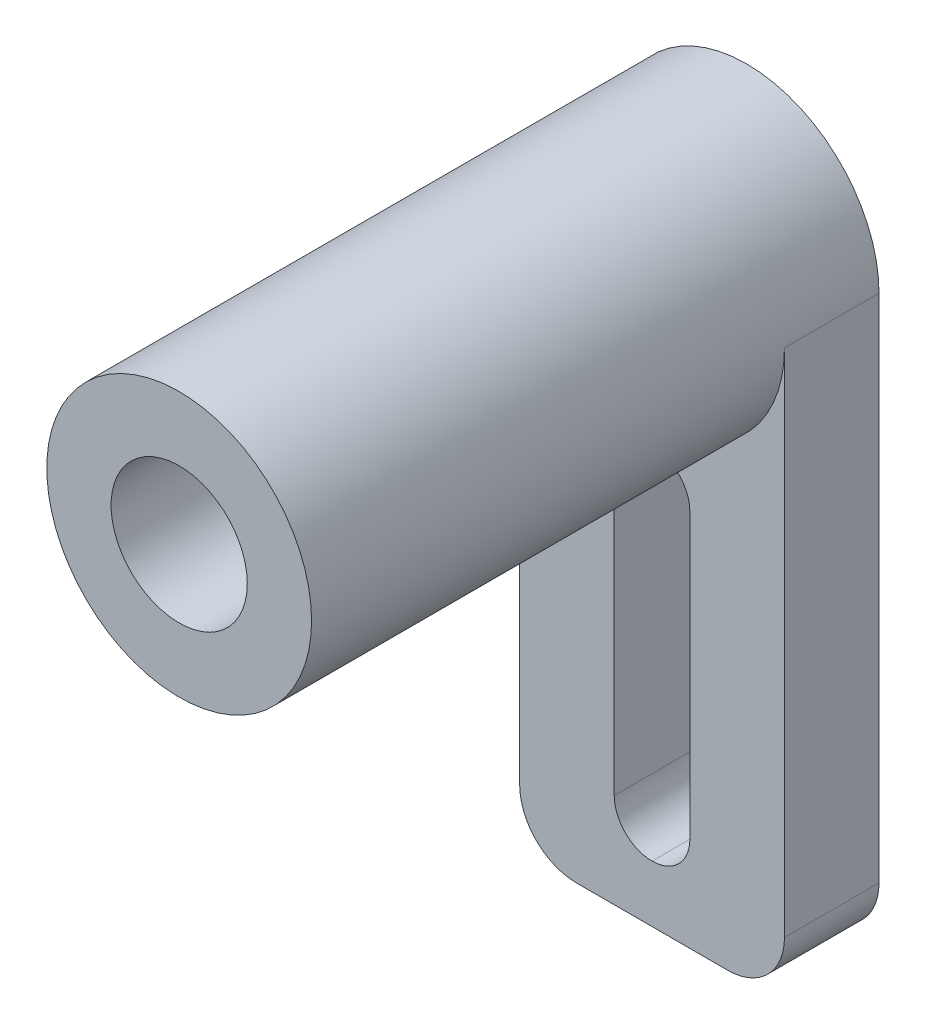
ISO-10303-21;
HEADER;
FILE_DESCRIPTION(('STEP AP214'),'2;1');
FILE_NAME('part.step','',(''),(''),'','','');
FILE_SCHEMA(('AUTOMOTIVE_DESIGN { 1 0 10303 214 1 1 1 1 }'));
ENDSEC;
DATA;
#1=APPLICATION_CONTEXT('core data for automotive mechanical design processes');
#2=APPLICATION_PROTOCOL_DEFINITION('international standard','automotive_design',2000,#1);
#3=PRODUCT_CONTEXT('',#1,'mechanical');
#4=PRODUCT('Part','Part','',(#3));
#5=PRODUCT_RELATED_PRODUCT_CATEGORY('part','',(#4));
#6=PRODUCT_DEFINITION_FORMATION('','',#4);
#7=PRODUCT_DEFINITION_CONTEXT('part definition',#1,'design');
#8=PRODUCT_DEFINITION('design','',#6,#7);
#9=PRODUCT_DEFINITION_SHAPE('','',#8);
#10=(LENGTH_UNIT() NAMED_UNIT(*) SI_UNIT(.MILLI.,.METRE.));
#11=(NAMED_UNIT(*) PLANE_ANGLE_UNIT() SI_UNIT($,.RADIAN.));
#12=(NAMED_UNIT(*) SI_UNIT($,.STERADIAN.) SOLID_ANGLE_UNIT());
#13=UNCERTAINTY_MEASURE_WITH_UNIT(LENGTH_MEASURE(1.E-05),#10,'distance_accuracy_value','');
#14=(GEOMETRIC_REPRESENTATION_CONTEXT(3) GLOBAL_UNCERTAINTY_ASSIGNED_CONTEXT((#13)) GLOBAL_UNIT_ASSIGNED_CONTEXT((#10,
#11,#12)) REPRESENTATION_CONTEXT('',''));
#15=CARTESIAN_POINT('',(0.,0.,0.));
#16=DIRECTION('',(0.,0.,1.));
#17=DIRECTION('',(1.,0.,0.));
#18=AXIS2_PLACEMENT_3D('',#15,#16,#17);
#19=CARTESIAN_POINT('',(7.,30.,30.));
#20=DIRECTION('',(0.,0.,-1.));
#21=DIRECTION('',(-1.,0.,0.));
#22=AXIS2_PLACEMENT_3D('',#19,#20,#21);
#23=CYLINDRICAL_SURFACE('',#22,3.05);
#24=CARTESIAN_POINT('',(7.,30.,1.));
#25=DIRECTION('',(0.,0.,-1.));
#26=DIRECTION('',(-1.,0.,0.));
#27=AXIS2_PLACEMENT_3D('',#24,#25,#26);
#28=CIRCLE('',#27,3.05);
#29=CARTESIAN_POINT('',(3.95,30.,1.));
#30=VERTEX_POINT('',#29);
#31=EDGE_CURVE('E153',#30,#30,#28,.T.);
#32=ORIENTED_EDGE('',*,*,#31,.T.);
#33=EDGE_LOOP('',(#32));
#34=FACE_BOUND('',#33,.T.);
#35=CARTESIAN_POINT('',(7.,30.,8.));
#36=DIRECTION('',(0.,0.,1.));
#37=DIRECTION('',(1.,0.,0.));
#38=AXIS2_PLACEMENT_3D('',#35,#36,#37);
#39=CIRCLE('',#38,3.05);
#40=CARTESIAN_POINT('',(10.05,30.,8.));
#41=VERTEX_POINT('',#40);
#42=EDGE_CURVE('E44',#41,#41,#39,.T.);
#43=ORIENTED_EDGE('',*,*,#42,.T.);
#44=EDGE_LOOP('',(#43));
#45=FACE_BOUND('',#44,.T.);
#46=ADVANCED_FACE('F40',(#34,#45),#23,.F.);
#47=CARTESIAN_POINT('',(7.,30.,30.));
#48=DIRECTION('',(0.,0.,-1.));
#49=DIRECTION('',(-1.,0.,0.));
#50=AXIS2_PLACEMENT_3D('',#47,#48,#49);
#51=CYLINDRICAL_SURFACE('',#50,7.);
#52=CARTESIAN_POINT('',(7.,30.,30.));
#53=DIRECTION('',(0.,0.,1.));
#54=DIRECTION('',(1.,0.,0.));
#55=AXIS2_PLACEMENT_3D('',#52,#53,#54);
#56=CIRCLE('',#55,7.);
#57=CARTESIAN_POINT('',(14.,30.,30.));
#58=VERTEX_POINT('',#57);
#59=EDGE_CURVE('E146',#58,#58,#56,.T.);
#60=ORIENTED_EDGE('',*,*,#59,.F.);
#61=EDGE_LOOP('',(#60));
#62=FACE_BOUND('',#61,.T.);
#63=DIRECTION('',(0.,0.,-1.));
#64=VECTOR('',#63,1.);
#65=CARTESIAN_POINT('',(0.,30.,5.));
#66=LINE('',#65,#64);
#67=CARTESIAN_POINT('',(0.,30.,5.));
#68=VERTEX_POINT('',#67);
#69=CARTESIAN_POINT('',(0.,30.,0.));
#70=VERTEX_POINT('',#69);
#71=EDGE_CURVE('E151',#68,#70,#66,.T.);
#72=ORIENTED_EDGE('',*,*,#71,.F.);
#73=CARTESIAN_POINT('',(7.,30.,5.));
#74=DIRECTION('',(0.,0.,-1.));
#75=DIRECTION('',(-1.,0.,0.));
#76=AXIS2_PLACEMENT_3D('',#73,#74,#75);
#77=CIRCLE('',#76,7.);
#78=CARTESIAN_POINT('',(14.,30.,5.));
#79=VERTEX_POINT('',#78);
#80=EDGE_CURVE('E150',#68,#79,#77,.F.);
#81=ORIENTED_EDGE('',*,*,#80,.T.);
#82=DIRECTION('',(0.,0.,-1.));
#83=VECTOR('',#82,1.);
#84=CARTESIAN_POINT('',(14.,30.,5.));
#85=LINE('',#84,#83);
#86=CARTESIAN_POINT('',(14.,30.,0.));
#87=VERTEX_POINT('',#86);
#88=EDGE_CURVE('E137',#79,#87,#85,.T.);
#89=ORIENTED_EDGE('',*,*,#88,.T.);
#90=CARTESIAN_POINT('',(7.,30.,0.));
#91=DIRECTION('',(0.,0.,1.));
#92=DIRECTION('',(1.,0.,0.));
#93=AXIS2_PLACEMENT_3D('',#90,#91,#92);
#94=CIRCLE('',#93,7.);
#95=EDGE_CURVE('E141',#87,#70,#94,.T.);
#96=ORIENTED_EDGE('',*,*,#95,.T.);
#97=EDGE_LOOP('',(#72,#81,#89,#96));
#98=FACE_BOUND('',#97,.T.);
#99=ADVANCED_FACE('F149',(#62,#98),#51,.T.);
#100=CARTESIAN_POINT('',(0.,0.,5.));
#101=DIRECTION('',(1.,0.,0.));
#102=DIRECTION('',(0.,0.,-1.));
#103=AXIS2_PLACEMENT_3D('',#100,#101,#102);
#104=PLANE('',#103);
#105=DIRECTION('',(0.,-1.,0.));
#106=VECTOR('',#105,1.);
#107=CARTESIAN_POINT('',(0.,0.,0.));
#108=LINE('',#107,#106);
#109=CARTESIAN_POINT('',(0.,3.,0.));
#110=VERTEX_POINT('',#109);
#111=EDGE_CURVE('E65',#70,#110,#108,.T.);
#112=ORIENTED_EDGE('',*,*,#111,.T.);
#113=DIRECTION('',(0.,0.,-1.));
#114=VECTOR('',#113,1.);
#115=CARTESIAN_POINT('',(0.,3.,5.));
#116=LINE('',#115,#114);
#117=CARTESIAN_POINT('',(0.,3.,5.));
#118=VERTEX_POINT('',#117);
#119=EDGE_CURVE('E222',#110,#118,#116,.F.);
#120=ORIENTED_EDGE('',*,*,#119,.T.);
#121=DIRECTION('',(0.,-1.,0.));
#122=VECTOR('',#121,1.);
#123=CARTESIAN_POINT('',(0.,0.,5.));
#124=LINE('',#123,#122);
#125=EDGE_CURVE('E57',#68,#118,#124,.T.);
#126=ORIENTED_EDGE('',*,*,#125,.F.);
#127=ORIENTED_EDGE('',*,*,#71,.T.);
#128=EDGE_LOOP('',(#112,#120,#126,#127));
#129=FACE_BOUND('',#128,.T.);
#130=ADVANCED_FACE('F264',(#129),#104,.F.);
#131=CARTESIAN_POINT('',(0.,0.,5.));
#132=DIRECTION('',(0.,1.,0.));
#133=DIRECTION('',(0.,0.,1.));
#134=AXIS2_PLACEMENT_3D('',#131,#132,#133);
#135=PLANE('',#134);
#136=DIRECTION('',(1.,0.,0.));
#137=VECTOR('',#136,1.);
#138=CARTESIAN_POINT('',(0.,0.,5.));
#139=LINE('',#138,#137);
#140=CARTESIAN_POINT('',(3.,0.,5.));
#141=VERTEX_POINT('',#140);
#142=CARTESIAN_POINT('',(11.,0.,5.));
#143=VERTEX_POINT('',#142);
#144=EDGE_CURVE('E175',#141,#143,#139,.T.);
#145=ORIENTED_EDGE('',*,*,#144,.F.);
#146=DIRECTION('',(0.,0.,-1.));
#147=VECTOR('',#146,1.);
#148=CARTESIAN_POINT('',(3.,0.,5.));
#149=LINE('',#148,#147);
#150=CARTESIAN_POINT('',(3.,0.,0.));
#151=VERTEX_POINT('',#150);
#152=EDGE_CURVE('E215',#141,#151,#149,.T.);
#153=ORIENTED_EDGE('',*,*,#152,.T.);
#154=DIRECTION('',(1.,0.,0.));
#155=VECTOR('',#154,1.);
#156=CARTESIAN_POINT('',(0.,0.,0.));
#157=LINE('',#156,#155);
#158=CARTESIAN_POINT('',(11.,0.,0.));
#159=VERTEX_POINT('',#158);
#160=EDGE_CURVE('E139',#151,#159,#157,.T.);
#161=ORIENTED_EDGE('',*,*,#160,.T.);
#162=DIRECTION('',(0.,0.,-1.));
#163=VECTOR('',#162,1.);
#164=CARTESIAN_POINT('',(11.,0.,5.));
#165=LINE('',#164,#163);
#166=EDGE_CURVE('E209',#159,#143,#165,.F.);
#167=ORIENTED_EDGE('',*,*,#166,.T.);
#168=EDGE_LOOP('',(#145,#153,#161,#167));
#169=FACE_BOUND('',#168,.T.);
#170=ADVANCED_FACE('F292',(#169),#135,.F.);
#171=CARTESIAN_POINT('',(14.,0.,5.));
#172=DIRECTION('',(-1.,0.,0.));
#173=DIRECTION('',(0.,0.,1.));
#174=AXIS2_PLACEMENT_3D('',#171,#172,#173);
#175=PLANE('',#174);
#176=DIRECTION('',(0.,1.,0.));
#177=VECTOR('',#176,1.);
#178=CARTESIAN_POINT('',(14.,0.,5.));
#179=LINE('',#178,#177);
#180=CARTESIAN_POINT('',(14.,3.,5.));
#181=VERTEX_POINT('',#180);
#182=EDGE_CURVE('E178',#181,#79,#179,.T.);
#183=ORIENTED_EDGE('',*,*,#182,.F.);
#184=DIRECTION('',(0.,0.,-1.));
#185=VECTOR('',#184,1.);
#186=CARTESIAN_POINT('',(14.,3.,5.));
#187=LINE('',#186,#185);
#188=CARTESIAN_POINT('',(14.,3.,0.));
#189=VERTEX_POINT('',#188);
#190=EDGE_CURVE('E11',#181,#189,#187,.T.);
#191=ORIENTED_EDGE('',*,*,#190,.T.);
#192=DIRECTION('',(0.,1.,0.));
#193=VECTOR('',#192,1.);
#194=CARTESIAN_POINT('',(14.,0.,0.));
#195=LINE('',#194,#193);
#196=EDGE_CURVE('E133',#189,#87,#195,.T.);
#197=ORIENTED_EDGE('',*,*,#196,.T.);
#198=ORIENTED_EDGE('',*,*,#88,.F.);
#199=EDGE_LOOP('',(#183,#191,#197,#198));
#200=FACE_BOUND('',#199,.T.);
#201=ADVANCED_FACE('F135',(#200),#175,.F.);
#202=CARTESIAN_POINT('',(0.,0.,5.));
#203=DIRECTION('',(0.,0.,-1.));
#204=DIRECTION('',(-1.,0.,0.));
#205=AXIS2_PLACEMENT_3D('',#202,#203,#204);
#206=PLANE('',#205);
#207=ORIENTED_EDGE('',*,*,#80,.F.);
#208=ORIENTED_EDGE('',*,*,#125,.T.);
#209=CARTESIAN_POINT('',(3.,3.,5.));
#210=DIRECTION('',(0.,0.,-1.));
#211=DIRECTION('',(-1.,0.,0.));
#212=AXIS2_PLACEMENT_3D('',#209,#210,#211);
#213=CIRCLE('',#212,3.);
#214=EDGE_CURVE('E49',#118,#141,#213,.F.);
#215=ORIENTED_EDGE('',*,*,#214,.T.);
#216=ORIENTED_EDGE('',*,*,#144,.T.);
#217=CARTESIAN_POINT('',(11.,3.,5.));
#218=DIRECTION('',(0.,0.,-1.));
#219=DIRECTION('',(-1.,0.,0.));
#220=AXIS2_PLACEMENT_3D('',#217,#218,#219);
#221=CIRCLE('',#220,3.);
#222=EDGE_CURVE('E224',#143,#181,#221,.F.);
#223=ORIENTED_EDGE('',*,*,#222,.T.);
#224=ORIENTED_EDGE('',*,*,#182,.T.);
#225=EDGE_LOOP('',(#207,#208,#215,#216,#223,#224));
#226=FACE_BOUND('',#225,.T.);
#227=DIRECTION('',(0.,1.,0.));
#228=VECTOR('',#227,1.);
#229=CARTESIAN_POINT('',(9.,22.,5.));
#230=LINE('',#229,#228);
#231=CARTESIAN_POINT('',(9.,5.,5.));
#232=VERTEX_POINT('',#231);
#233=CARTESIAN_POINT('',(9.,20.,5.));
#234=VERTEX_POINT('',#233);
#235=EDGE_CURVE('E165',#232,#234,#230,.T.);
#236=ORIENTED_EDGE('',*,*,#235,.F.);
#237=CARTESIAN_POINT('',(7.,5.,5.));
#238=DIRECTION('',(0.,0.,-1.));
#239=DIRECTION('',(-1.,0.,0.));
#240=AXIS2_PLACEMENT_3D('',#237,#238,#239);
#241=CIRCLE('',#240,2.);
#242=CARTESIAN_POINT('',(7.,3.,5.));
#243=VERTEX_POINT('',#242);
#244=EDGE_CURVE('E197',#232,#243,#241,.T.);
#245=ORIENTED_EDGE('',*,*,#244,.T.);
#246=CARTESIAN_POINT('',(7.,5.,5.));
#247=DIRECTION('',(0.,0.,-1.));
#248=DIRECTION('',(-1.,0.,0.));
#249=AXIS2_PLACEMENT_3D('',#246,#247,#248);
#250=CIRCLE('',#249,2.);
#251=CARTESIAN_POINT('',(5.,5.,5.));
#252=VERTEX_POINT('',#251);
#253=EDGE_CURVE('E193',#243,#252,#250,.T.);
#254=ORIENTED_EDGE('',*,*,#253,.T.);
#255=DIRECTION('',(0.,-1.,0.));
#256=VECTOR('',#255,1.);
#257=CARTESIAN_POINT('',(5.,22.,5.));
#258=LINE('',#257,#256);
#259=CARTESIAN_POINT('',(5.,20.,5.));
#260=VERTEX_POINT('',#259);
#261=EDGE_CURVE('E168',#260,#252,#258,.T.);
#262=ORIENTED_EDGE('',*,*,#261,.F.);
#263=CARTESIAN_POINT('',(7.,20.,5.));
#264=DIRECTION('',(0.,0.,-1.));
#265=DIRECTION('',(-1.,0.,0.));
#266=AXIS2_PLACEMENT_3D('',#263,#264,#265);
#267=CIRCLE('',#266,2.);
#268=CARTESIAN_POINT('',(7.,22.,5.));
#269=VERTEX_POINT('',#268);
#270=EDGE_CURVE('E205',#260,#269,#267,.T.);
#271=ORIENTED_EDGE('',*,*,#270,.T.);
#272=CARTESIAN_POINT('',(7.,20.,5.));
#273=DIRECTION('',(0.,0.,-1.));
#274=DIRECTION('',(-1.,0.,0.));
#275=AXIS2_PLACEMENT_3D('',#272,#273,#274);
#276=CIRCLE('',#275,2.);
#277=EDGE_CURVE('E201',#269,#234,#276,.T.);
#278=ORIENTED_EDGE('',*,*,#277,.T.);
#279=EDGE_LOOP('',(#236,#245,#254,#262,#271,#278));
#280=FACE_BOUND('',#279,.T.);
#281=ADVANCED_FACE('F284',(#226,#280),#206,.F.);
#282=CARTESIAN_POINT('',(0.,0.,0.));
#283=DIRECTION('',(0.,0.,-1.));
#284=DIRECTION('',(-1.,0.,0.));
#285=AXIS2_PLACEMENT_3D('',#282,#283,#284);
#286=PLANE('',#285);
#287=ORIENTED_EDGE('',*,*,#111,.F.);
#288=ORIENTED_EDGE('',*,*,#95,.F.);
#289=ORIENTED_EDGE('',*,*,#196,.F.);
#290=CARTESIAN_POINT('',(11.,3.,0.));
#291=DIRECTION('',(0.,0.,-1.));
#292=DIRECTION('',(-1.,0.,0.));
#293=AXIS2_PLACEMENT_3D('',#290,#291,#292);
#294=CIRCLE('',#293,3.);
#295=EDGE_CURVE('E218',#189,#159,#294,.T.);
#296=ORIENTED_EDGE('',*,*,#295,.T.);
#297=ORIENTED_EDGE('',*,*,#160,.F.);
#298=CARTESIAN_POINT('',(3.,3.,0.));
#299=DIRECTION('',(0.,0.,-1.));
#300=DIRECTION('',(-1.,0.,0.));
#301=AXIS2_PLACEMENT_3D('',#298,#299,#300);
#302=CIRCLE('',#301,3.);
#303=EDGE_CURVE('E220',#151,#110,#302,.T.);
#304=ORIENTED_EDGE('',*,*,#303,.T.);
#305=EDGE_LOOP('',(#287,#288,#289,#296,#297,#304));
#306=FACE_BOUND('',#305,.T.);
#307=CARTESIAN_POINT('',(7.,20.,0.));
#308=DIRECTION('',(0.,0.,-1.));
#309=DIRECTION('',(-1.,0.,0.));
#310=AXIS2_PLACEMENT_3D('',#307,#308,#309);
#311=CIRCLE('',#310,2.);
#312=CARTESIAN_POINT('',(9.,20.,0.));
#313=VERTEX_POINT('',#312);
#314=CARTESIAN_POINT('',(7.,22.,0.));
#315=VERTEX_POINT('',#314);
#316=EDGE_CURVE('E203',#313,#315,#311,.F.);
#317=ORIENTED_EDGE('',*,*,#316,.T.);
#318=CARTESIAN_POINT('',(7.,20.,0.));
#319=DIRECTION('',(0.,0.,-1.));
#320=DIRECTION('',(-1.,0.,0.));
#321=AXIS2_PLACEMENT_3D('',#318,#319,#320);
#322=CIRCLE('',#321,2.);
#323=CARTESIAN_POINT('',(5.,20.,0.));
#324=VERTEX_POINT('',#323);
#325=EDGE_CURVE('E207',#315,#324,#322,.F.);
#326=ORIENTED_EDGE('',*,*,#325,.T.);
#327=DIRECTION('',(0.,-1.,0.));
#328=VECTOR('',#327,1.);
#329=CARTESIAN_POINT('',(5.,22.,0.));
#330=LINE('',#329,#328);
#331=CARTESIAN_POINT('',(5.,5.,0.));
#332=VERTEX_POINT('',#331);
#333=EDGE_CURVE('E161',#324,#332,#330,.T.);
#334=ORIENTED_EDGE('',*,*,#333,.T.);
#335=CARTESIAN_POINT('',(7.,5.,0.));
#336=DIRECTION('',(0.,0.,-1.));
#337=DIRECTION('',(-1.,0.,0.));
#338=AXIS2_PLACEMENT_3D('',#335,#336,#337);
#339=CIRCLE('',#338,2.);
#340=CARTESIAN_POINT('',(7.,3.,0.));
#341=VERTEX_POINT('',#340);
#342=EDGE_CURVE('E195',#332,#341,#339,.F.);
#343=ORIENTED_EDGE('',*,*,#342,.T.);
#344=CARTESIAN_POINT('',(7.,5.,0.));
#345=DIRECTION('',(0.,0.,-1.));
#346=DIRECTION('',(-1.,0.,0.));
#347=AXIS2_PLACEMENT_3D('',#344,#345,#346);
#348=CIRCLE('',#347,2.);
#349=CARTESIAN_POINT('',(9.,5.,0.));
#350=VERTEX_POINT('',#349);
#351=EDGE_CURVE('E199',#341,#350,#348,.F.);
#352=ORIENTED_EDGE('',*,*,#351,.T.);
#353=DIRECTION('',(0.,1.,0.));
#354=VECTOR('',#353,1.);
#355=CARTESIAN_POINT('',(9.,22.,0.));
#356=LINE('',#355,#354);
#357=EDGE_CURVE('E164',#350,#313,#356,.T.);
#358=ORIENTED_EDGE('',*,*,#357,.T.);
#359=EDGE_LOOP('',(#317,#326,#334,#343,#352,#358));
#360=FACE_BOUND('',#359,.T.);
#361=CARTESIAN_POINT('',(7.,30.,0.));
#362=DIRECTION('',(0.,0.,-1.));
#363=DIRECTION('',(-1.,0.,0.));
#364=AXIS2_PLACEMENT_3D('',#361,#362,#363);
#365=CIRCLE('',#364,2.2);
#366=CARTESIAN_POINT('',(4.8,30.,0.));
#367=VERTEX_POINT('',#366);
#368=EDGE_CURVE('E231',#367,#367,#365,.T.);
#369=ORIENTED_EDGE('',*,*,#368,.F.);
#370=EDGE_LOOP('',(#369));
#371=FACE_BOUND('',#370,.T.);
#372=ADVANCED_FACE('F142',(#306,#360,#371),#286,.T.);
#373=CARTESIAN_POINT('',(5.,22.,0.));
#374=DIRECTION('',(-1.,0.,0.));
#375=DIRECTION('',(0.,0.,1.));
#376=AXIS2_PLACEMENT_3D('',#373,#374,#375);
#377=PLANE('',#376);
#378=ORIENTED_EDGE('',*,*,#261,.T.);
#379=DIRECTION('',(0.,0.,1.));
#380=VECTOR('',#379,1.);
#381=CARTESIAN_POINT('',(5.,5.,0.));
#382=LINE('',#381,#380);
#383=EDGE_CURVE('E185',#252,#332,#382,.F.);
#384=ORIENTED_EDGE('',*,*,#383,.T.);
#385=ORIENTED_EDGE('',*,*,#333,.F.);
#386=DIRECTION('',(0.,0.,1.));
#387=VECTOR('',#386,1.);
#388=CARTESIAN_POINT('',(5.,20.,5.));
#389=LINE('',#388,#387);
#390=EDGE_CURVE('E180',#324,#260,#389,.T.);
#391=ORIENTED_EDGE('',*,*,#390,.T.);
#392=EDGE_LOOP('',(#378,#384,#385,#391));
#393=FACE_BOUND('',#392,.T.);
#394=ADVANCED_FACE('F279',(#393),#377,.F.);
#395=CARTESIAN_POINT('',(9.,22.,0.));
#396=DIRECTION('',(1.,0.,0.));
#397=DIRECTION('',(0.,1.,0.));
#398=AXIS2_PLACEMENT_3D('',#395,#396,#397);
#399=PLANE('',#398);
#400=ORIENTED_EDGE('',*,*,#357,.F.);
#401=DIRECTION('',(0.,0.,1.));
#402=VECTOR('',#401,1.);
#403=CARTESIAN_POINT('',(9.,5.,5.));
#404=LINE('',#403,#402);
#405=EDGE_CURVE('E191',#350,#232,#404,.T.);
#406=ORIENTED_EDGE('',*,*,#405,.T.);
#407=ORIENTED_EDGE('',*,*,#235,.T.);
#408=DIRECTION('',(0.,0.,1.));
#409=VECTOR('',#408,1.);
#410=CARTESIAN_POINT('',(9.,20.,0.));
#411=LINE('',#410,#409);
#412=EDGE_CURVE('E188',#234,#313,#411,.F.);
#413=ORIENTED_EDGE('',*,*,#412,.T.);
#414=EDGE_LOOP('',(#400,#406,#407,#413));
#415=FACE_BOUND('',#414,.T.);
#416=ADVANCED_FACE('F275',(#415),#399,.F.);
#417=CARTESIAN_POINT('',(7.,5.,0.));
#418=DIRECTION('',(0.,0.,-1.));
#419=DIRECTION('',(-1.,0.,0.));
#420=AXIS2_PLACEMENT_3D('',#417,#418,#419);
#421=CYLINDRICAL_SURFACE('',#420,2.);
#422=ORIENTED_EDGE('',*,*,#405,.F.);
#423=ORIENTED_EDGE('',*,*,#351,.F.);
#424=DIRECTION('',(0.,0.,1.));
#425=VECTOR('',#424,1.);
#426=CARTESIAN_POINT('',(7.,3.,0.));
#427=LINE('',#426,#425);
#428=EDGE_CURVE('E171',#243,#341,#427,.F.);
#429=ORIENTED_EDGE('',*,*,#428,.F.);
#430=ORIENTED_EDGE('',*,*,#244,.F.);
#431=EDGE_LOOP('',(#422,#423,#429,#430));
#432=FACE_BOUND('',#431,.T.);
#433=ADVANCED_FACE('F278',(#432),#421,.F.);
#434=CARTESIAN_POINT('',(7.,5.,0.));
#435=DIRECTION('',(0.,0.,-1.));
#436=DIRECTION('',(-1.,0.,0.));
#437=AXIS2_PLACEMENT_3D('',#434,#435,#436);
#438=CYLINDRICAL_SURFACE('',#437,2.);
#439=ORIENTED_EDGE('',*,*,#342,.F.);
#440=ORIENTED_EDGE('',*,*,#383,.F.);
#441=ORIENTED_EDGE('',*,*,#253,.F.);
#442=ORIENTED_EDGE('',*,*,#428,.T.);
#443=EDGE_LOOP('',(#439,#440,#441,#442));
#444=FACE_BOUND('',#443,.T.);
#445=ADVANCED_FACE('F298',(#444),#438,.F.);
#446=CARTESIAN_POINT('',(7.,20.,0.));
#447=DIRECTION('',(0.,0.,-1.));
#448=DIRECTION('',(-1.,0.,0.));
#449=AXIS2_PLACEMENT_3D('',#446,#447,#448);
#450=CYLINDRICAL_SURFACE('',#449,2.);
#451=ORIENTED_EDGE('',*,*,#390,.F.);
#452=ORIENTED_EDGE('',*,*,#325,.F.);
#453=DIRECTION('',(0.,0.,1.));
#454=VECTOR('',#453,1.);
#455=CARTESIAN_POINT('',(7.,22.,0.));
#456=LINE('',#455,#454);
#457=EDGE_CURVE('E160',#269,#315,#456,.F.);
#458=ORIENTED_EDGE('',*,*,#457,.F.);
#459=ORIENTED_EDGE('',*,*,#270,.F.);
#460=EDGE_LOOP('',(#451,#452,#458,#459));
#461=FACE_BOUND('',#460,.T.);
#462=ADVANCED_FACE('F301',(#461),#450,.F.);
#463=CARTESIAN_POINT('',(7.,20.,0.));
#464=DIRECTION('',(0.,0.,-1.));
#465=DIRECTION('',(-1.,0.,0.));
#466=AXIS2_PLACEMENT_3D('',#463,#464,#465);
#467=CYLINDRICAL_SURFACE('',#466,2.);
#468=ORIENTED_EDGE('',*,*,#316,.F.);
#469=ORIENTED_EDGE('',*,*,#412,.F.);
#470=ORIENTED_EDGE('',*,*,#277,.F.);
#471=ORIENTED_EDGE('',*,*,#457,.T.);
#472=EDGE_LOOP('',(#468,#469,#470,#471));
#473=FACE_BOUND('',#472,.T.);
#474=ADVANCED_FACE('F306',(#473),#467,.F.);
#475=CARTESIAN_POINT('',(3.,3.,5.));
#476=DIRECTION('',(0.,0.,-1.));
#477=DIRECTION('',(-1.,0.,0.));
#478=AXIS2_PLACEMENT_3D('',#475,#476,#477);
#479=CYLINDRICAL_SURFACE('',#478,3.);
#480=ORIENTED_EDGE('',*,*,#214,.F.);
#481=ORIENTED_EDGE('',*,*,#119,.F.);
#482=ORIENTED_EDGE('',*,*,#303,.F.);
#483=ORIENTED_EDGE('',*,*,#152,.F.);
#484=EDGE_LOOP('',(#480,#481,#482,#483));
#485=FACE_BOUND('',#484,.T.);
#486=ADVANCED_FACE('F309',(#485),#479,.T.);
#487=CARTESIAN_POINT('',(11.,3.,5.));
#488=DIRECTION('',(0.,0.,-1.));
#489=DIRECTION('',(-1.,0.,0.));
#490=AXIS2_PLACEMENT_3D('',#487,#488,#489);
#491=CYLINDRICAL_SURFACE('',#490,3.);
#492=ORIENTED_EDGE('',*,*,#222,.F.);
#493=ORIENTED_EDGE('',*,*,#166,.F.);
#494=ORIENTED_EDGE('',*,*,#295,.F.);
#495=ORIENTED_EDGE('',*,*,#190,.F.);
#496=EDGE_LOOP('',(#492,#493,#494,#495));
#497=FACE_BOUND('',#496,.T.);
#498=ADVANCED_FACE('F42',(#497),#491,.T.);
#499=CARTESIAN_POINT('',(7.,30.,30.));
#500=DIRECTION('',(0.,0.,1.));
#501=DIRECTION('',(1.,0.,0.));
#502=AXIS2_PLACEMENT_3D('',#499,#500,#501);
#503=PLANE('',#502);
#504=CARTESIAN_POINT('',(7.,30.,30.));
#505=DIRECTION('',(0.,0.,1.));
#506=DIRECTION('',(1.,0.,0.));
#507=AXIS2_PLACEMENT_3D('',#504,#505,#506);
#508=CIRCLE('',#507,3.6);
#509=CARTESIAN_POINT('',(10.6,30.,30.));
#510=VERTEX_POINT('',#509);
#511=EDGE_CURVE('E237',#510,#510,#508,.T.);
#512=ORIENTED_EDGE('',*,*,#511,.F.);
#513=EDGE_LOOP('',(#512));
#514=FACE_BOUND('',#513,.T.);
#515=ORIENTED_EDGE('',*,*,#59,.T.);
#516=EDGE_LOOP('',(#515));
#517=FACE_BOUND('',#516,.T.);
#518=ADVANCED_FACE('F271',(#514,#517),#503,.T.);
#519=CARTESIAN_POINT('',(7.,30.,1.));
#520=DIRECTION('',(0.,0.,-1.));
#521=DIRECTION('',(-1.,0.,0.));
#522=AXIS2_PLACEMENT_3D('',#519,#520,#521);
#523=PLANE('',#522);
#524=CARTESIAN_POINT('',(7.,30.,1.));
#525=DIRECTION('',(0.,0.,-1.));
#526=DIRECTION('',(-1.,0.,0.));
#527=AXIS2_PLACEMENT_3D('',#524,#525,#526);
#528=CIRCLE('',#527,2.2);
#529=CARTESIAN_POINT('',(4.8,30.,1.));
#530=VERTEX_POINT('',#529);
#531=EDGE_CURVE('E227',#530,#530,#528,.T.);
#532=ORIENTED_EDGE('',*,*,#531,.T.);
#533=EDGE_LOOP('',(#532));
#534=FACE_BOUND('',#533,.T.);
#535=ORIENTED_EDGE('',*,*,#31,.F.);
#536=EDGE_LOOP('',(#535));
#537=FACE_BOUND('',#536,.T.);
#538=ADVANCED_FACE('F269',(#534,#537),#523,.F.);
#539=CARTESIAN_POINT('',(7.,30.,1.));
#540=DIRECTION('',(0.,0.,-1.));
#541=DIRECTION('',(-1.,0.,0.));
#542=AXIS2_PLACEMENT_3D('',#539,#540,#541);
#543=CYLINDRICAL_SURFACE('',#542,2.2);
#544=ORIENTED_EDGE('',*,*,#531,.F.);
#545=EDGE_LOOP('',(#544));
#546=FACE_BOUND('',#545,.T.);
#547=ORIENTED_EDGE('',*,*,#368,.T.);
#548=EDGE_LOOP('',(#547));
#549=FACE_BOUND('',#548,.T.);
#550=ADVANCED_FACE('F255',(#546,#549),#543,.F.);
#551=CARTESIAN_POINT('',(7.,30.,8.));
#552=DIRECTION('',(0.,0.,1.));
#553=DIRECTION('',(1.,0.,0.));
#554=AXIS2_PLACEMENT_3D('',#551,#552,#553);
#555=CYLINDRICAL_SURFACE('',#554,3.6);
#556=CARTESIAN_POINT('',(7.,30.,8.));
#557=DIRECTION('',(0.,0.,1.));
#558=DIRECTION('',(1.,0.,0.));
#559=AXIS2_PLACEMENT_3D('',#556,#557,#558);
#560=CIRCLE('',#559,3.6);
#561=CARTESIAN_POINT('',(10.6,30.,8.));
#562=VERTEX_POINT('',#561);
#563=EDGE_CURVE('E240',#562,#562,#560,.T.);
#564=ORIENTED_EDGE('',*,*,#563,.F.);
#565=EDGE_LOOP('',(#564));
#566=FACE_BOUND('',#565,.T.);
#567=ORIENTED_EDGE('',*,*,#511,.T.);
#568=EDGE_LOOP('',(#567));
#569=FACE_BOUND('',#568,.T.);
#570=ADVANCED_FACE('F250',(#566,#569),#555,.F.);
#571=CARTESIAN_POINT('',(7.,30.,8.));
#572=DIRECTION('',(0.,0.,1.));
#573=DIRECTION('',(1.,0.,0.));
#574=AXIS2_PLACEMENT_3D('',#571,#572,#573);
#575=PLANE('',#574);
#576=ORIENTED_EDGE('',*,*,#42,.F.);
#577=EDGE_LOOP('',(#576));
#578=FACE_BOUND('',#577,.T.);
#579=ORIENTED_EDGE('',*,*,#563,.T.);
#580=EDGE_LOOP('',(#579));
#581=FACE_BOUND('',#580,.T.);
#582=ADVANCED_FACE('F248',(#578,#581),#575,.T.);
#583=CLOSED_SHELL('',(#46,#99,#130,#170,#201,#281,#372,#394,#416,#433,#445,#462,#474,#486,#498,
#518,#538,#550,#570,#582));
#584=MANIFOLD_SOLID_BREP('B2',#583);
#585=ADVANCED_BREP_SHAPE_REPRESENTATION('',(#18,#584),#14);
#586=SHAPE_DEFINITION_REPRESENTATION(#9,#585);
ENDSEC;
END-ISO-10303-21;
